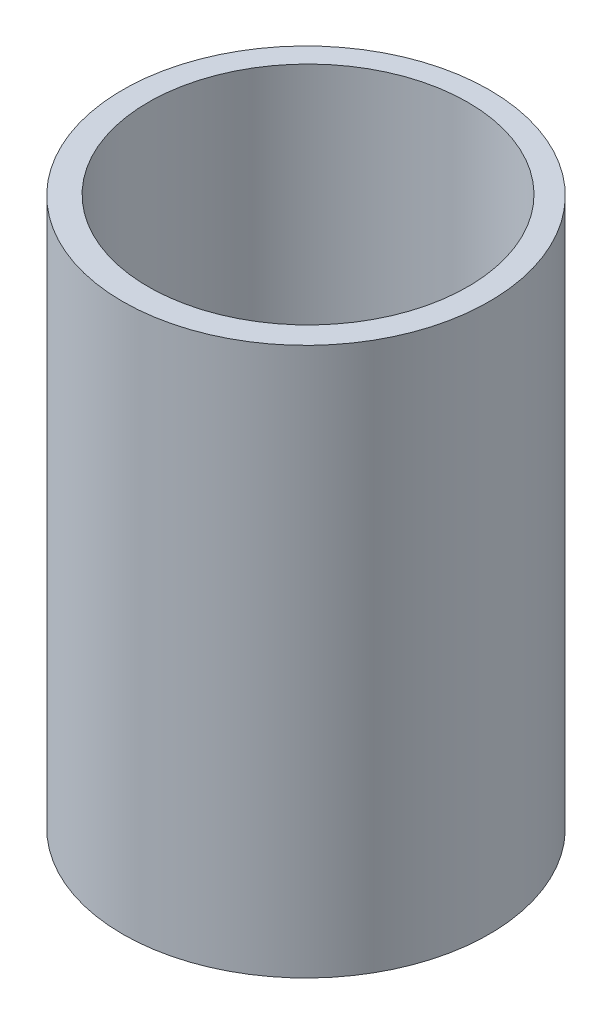
ISO-10303-21;
HEADER;
FILE_DESCRIPTION(('STEP AP214'),'2;1');
FILE_NAME('part.step','',(''),(''),'','','');
FILE_SCHEMA(('AUTOMOTIVE_DESIGN { 1 0 10303 214 1 1 1 1 }'));
ENDSEC;
DATA;
#1=APPLICATION_CONTEXT('core data for automotive mechanical design processes');
#2=APPLICATION_PROTOCOL_DEFINITION('international standard','automotive_design',2000,#1);
#3=PRODUCT_CONTEXT('',#1,'mechanical');
#4=PRODUCT('Part','Part','',(#3));
#5=PRODUCT_RELATED_PRODUCT_CATEGORY('part','',(#4));
#6=PRODUCT_DEFINITION_FORMATION('','',#4);
#7=PRODUCT_DEFINITION_CONTEXT('part definition',#1,'design');
#8=PRODUCT_DEFINITION('design','',#6,#7);
#9=PRODUCT_DEFINITION_SHAPE('','',#8);
#10=(LENGTH_UNIT() NAMED_UNIT(*) SI_UNIT(.MILLI.,.METRE.));
#11=(NAMED_UNIT(*) PLANE_ANGLE_UNIT() SI_UNIT($,.RADIAN.));
#12=(NAMED_UNIT(*) SI_UNIT($,.STERADIAN.) SOLID_ANGLE_UNIT());
#13=UNCERTAINTY_MEASURE_WITH_UNIT(LENGTH_MEASURE(1.E-05),#10,'distance_accuracy_value','');
#14=(GEOMETRIC_REPRESENTATION_CONTEXT(3) GLOBAL_UNCERTAINTY_ASSIGNED_CONTEXT((#13)) GLOBAL_UNIT_ASSIGNED_CONTEXT((#10,
#11,#12)) REPRESENTATION_CONTEXT('',''));
#15=CARTESIAN_POINT('',(0.,0.,0.));
#16=DIRECTION('',(0.,0.,1.));
#17=DIRECTION('',(1.,0.,0.));
#18=AXIS2_PLACEMENT_3D('',#15,#16,#17);
#19=CARTESIAN_POINT('',(0.,152.4,0.));
#20=DIRECTION('',(0.,1.,0.));
#21=DIRECTION('',(0.,0.,1.));
#22=AXIS2_PLACEMENT_3D('',#19,#20,#21);
#23=PLANE('',#22);
#24=CARTESIAN_POINT('',(0.,152.4,0.));
#25=DIRECTION('',(0.,1.,0.));
#26=DIRECTION('',(0.,0.,1.));
#27=AXIS2_PLACEMENT_3D('',#24,#25,#26);
#28=CIRCLE('',#27,51.);
#29=CARTESIAN_POINT('',(0.,152.4,-51.));
#30=VERTEX_POINT('',#29);
#31=EDGE_CURVE('E10',#30,#30,#28,.T.);
#32=ORIENTED_EDGE('',*,*,#31,.T.);
#33=EDGE_LOOP('',(#32));
#34=FACE_BOUND('',#33,.T.);
#35=CARTESIAN_POINT('',(0.,152.4,-0.566986597014049));
#36=DIRECTION('',(0.,1.,0.));
#37=DIRECTION('',(0.,0.,1.));
#38=AXIS2_PLACEMENT_3D('',#35,#36,#37);
#39=CIRCLE('',#38,44.45);
#40=CARTESIAN_POINT('',(0.,152.4,-45.0169865970141));
#41=VERTEX_POINT('',#40);
#42=EDGE_CURVE('E52',#41,#41,#39,.T.);
#43=ORIENTED_EDGE('',*,*,#42,.F.);
#44=EDGE_LOOP('',(#43));
#45=FACE_BOUND('',#44,.T.);
#46=ADVANCED_FACE('F39',(#34,#45),#23,.T.);
#47=CARTESIAN_POINT('',(0.,0.,0.));
#48=DIRECTION('',(0.,1.,0.));
#49=DIRECTION('',(0.,0.,1.));
#50=AXIS2_PLACEMENT_3D('',#47,#48,#49);
#51=PLANE('',#50);
#52=CARTESIAN_POINT('',(0.,0.,0.));
#53=DIRECTION('',(0.,1.,0.));
#54=DIRECTION('',(0.,0.,1.));
#55=AXIS2_PLACEMENT_3D('',#52,#53,#54);
#56=CIRCLE('',#55,51.);
#57=CARTESIAN_POINT('',(0.,0.,-51.));
#58=VERTEX_POINT('',#57);
#59=EDGE_CURVE('E43',#58,#58,#56,.T.);
#60=ORIENTED_EDGE('',*,*,#59,.F.);
#61=EDGE_LOOP('',(#60));
#62=FACE_BOUND('',#61,.T.);
#63=CARTESIAN_POINT('',(0.,0.,-0.566986597014049));
#64=DIRECTION('',(0.,1.,0.));
#65=DIRECTION('',(0.,0.,1.));
#66=AXIS2_PLACEMENT_3D('',#63,#64,#65);
#67=CIRCLE('',#66,44.45);
#68=CARTESIAN_POINT('',(0.,0.,-45.0169865970141));
#69=VERTEX_POINT('',#68);
#70=EDGE_CURVE('E54',#69,#69,#67,.T.);
#71=ORIENTED_EDGE('',*,*,#70,.T.);
#72=EDGE_LOOP('',(#71));
#73=FACE_BOUND('',#72,.T.);
#74=ADVANCED_FACE('F66',(#62,#73),#51,.F.);
#75=CARTESIAN_POINT('',(0.,152.4,0.));
#76=DIRECTION('',(0.,-1.,0.));
#77=DIRECTION('',(0.,0.,-1.));
#78=AXIS2_PLACEMENT_3D('',#75,#76,#77);
#79=CYLINDRICAL_SURFACE('',#78,51.);
#80=CARTESIAN_POINT('',(0.,152.4,-51.));
#81=CARTESIAN_POINT('',(0.,150.8125,-51.));
#82=CARTESIAN_POINT('',(0.,149.225,-51.));
#83=CARTESIAN_POINT('',(0.,146.05,-51.));
#84=CARTESIAN_POINT('',(0.,144.4625,-51.));
#85=CARTESIAN_POINT('',(0.,141.2875,-51.));
#86=CARTESIAN_POINT('',(0.,139.7,-51.));
#87=CARTESIAN_POINT('',(0.,136.525,-51.));
#88=CARTESIAN_POINT('',(0.,134.9375,-51.));
#89=CARTESIAN_POINT('',(0.,131.7625,-51.));
#90=CARTESIAN_POINT('',(0.,130.175,-51.));
#91=CARTESIAN_POINT('',(0.,127.,-51.));
#92=CARTESIAN_POINT('',(0.,125.4125,-51.));
#93=CARTESIAN_POINT('',(0.,122.2375,-51.));
#94=CARTESIAN_POINT('',(0.,120.65,-51.));
#95=CARTESIAN_POINT('',(0.,117.475,-51.));
#96=CARTESIAN_POINT('',(0.,115.8875,-51.));
#97=CARTESIAN_POINT('',(0.,112.7125,-51.));
#98=CARTESIAN_POINT('',(0.,111.125,-51.));
#99=CARTESIAN_POINT('',(0.,107.95,-51.));
#100=CARTESIAN_POINT('',(0.,106.3625,-51.));
#101=CARTESIAN_POINT('',(0.,103.1875,-51.));
#102=CARTESIAN_POINT('',(0.,101.6,-51.));
#103=CARTESIAN_POINT('',(0.,98.425,-51.));
#104=CARTESIAN_POINT('',(0.,96.8375,-51.));
#105=CARTESIAN_POINT('',(0.,93.6625,-51.));
#106=CARTESIAN_POINT('',(0.,92.075,-51.));
#107=CARTESIAN_POINT('',(0.,88.9,-51.));
#108=CARTESIAN_POINT('',(0.,87.3125,-51.));
#109=CARTESIAN_POINT('',(0.,84.1375,-51.));
#110=CARTESIAN_POINT('',(0.,82.55,-51.));
#111=CARTESIAN_POINT('',(0.,79.375,-51.));
#112=CARTESIAN_POINT('',(0.,77.7875,-51.));
#113=CARTESIAN_POINT('',(0.,74.6125,-51.));
#114=CARTESIAN_POINT('',(0.,73.025,-51.));
#115=CARTESIAN_POINT('',(0.,69.85,-51.));
#116=CARTESIAN_POINT('',(0.,68.2625,-51.));
#117=CARTESIAN_POINT('',(0.,65.0875,-51.));
#118=CARTESIAN_POINT('',(0.,63.5,-51.));
#119=CARTESIAN_POINT('',(0.,60.325,-51.));
#120=CARTESIAN_POINT('',(0.,58.7375,-51.));
#121=CARTESIAN_POINT('',(0.,55.5625,-51.));
#122=CARTESIAN_POINT('',(0.,53.975,-51.));
#123=CARTESIAN_POINT('',(0.,50.8,-51.));
#124=CARTESIAN_POINT('',(0.,49.2125,-51.));
#125=CARTESIAN_POINT('',(0.,46.0375,-51.));
#126=CARTESIAN_POINT('',(0.,44.45,-51.));
#127=CARTESIAN_POINT('',(0.,41.275,-51.));
#128=CARTESIAN_POINT('',(0.,39.6875,-51.));
#129=CARTESIAN_POINT('',(0.,36.5125,-51.));
#130=CARTESIAN_POINT('',(0.,34.925,-51.));
#131=CARTESIAN_POINT('',(0.,31.75,-51.));
#132=CARTESIAN_POINT('',(0.,30.1625,-51.));
#133=CARTESIAN_POINT('',(0.,26.9875,-51.));
#134=CARTESIAN_POINT('',(0.,25.4,-51.));
#135=CARTESIAN_POINT('',(0.,22.225,-51.));
#136=CARTESIAN_POINT('',(0.,20.6375,-51.));
#137=CARTESIAN_POINT('',(0.,17.4625,-51.));
#138=CARTESIAN_POINT('',(0.,15.875,-51.));
#139=CARTESIAN_POINT('',(0.,12.7,-51.));
#140=CARTESIAN_POINT('',(0.,11.1125,-51.));
#141=CARTESIAN_POINT('',(0.,7.93750000000001,-51.));
#142=CARTESIAN_POINT('',(0.,6.35,-51.));
#143=CARTESIAN_POINT('',(0.,3.175,-51.));
#144=CARTESIAN_POINT('',(0.,1.5875,-51.));
#145=CARTESIAN_POINT('',(0.,0.,-51.));
#146=B_SPLINE_CURVE_WITH_KNOTS('',3,(#80,#81,#82,#83,#84,#85,#86,#87,#88,#89,#90,#91,#92,#93,
#94,#95,#96,#97,#98,#99,#100,#101,#102,#103,#104,#105,#106,#107,#108,#109,#110,#111,#112,#113,
#114,#115,#116,#117,#118,#119,#120,#121,#122,#123,#124,#125,#126,#127,#128,#129,#130,#131,#132,
#133,#134,#135,#136,#137,#138,#139,#140,#141,#142,#143,#144,#145),.UNSPECIFIED.,.F.,.F.,(4,2,2,
2,2,2,2,2,2,2,2,2,2,2,2,2,2,2,2,2,2,2,2,2,2,2,2,2,2,2,2,2,4),(0.,4.7625,9.52500000000001,
14.2875,19.05,23.8125,28.575,33.3375,38.1,42.8625,47.625,52.3875,57.15,61.9125,66.675,71.4375,
76.2,80.9625,85.725,90.4875,95.25,100.0125,104.775,109.5375,114.3,119.0625,123.825,128.5875,
133.35,138.1125,142.875,147.6375,152.4),.UNSPECIFIED.);
#147=EDGE_CURVE('BSEAM41',#30,#58,#146,.T.);
#148=ORIENTED_EDGE('',*,*,#31,.F.);
#149=ORIENTED_EDGE('',*,*,#59,.T.);
#150=ORIENTED_EDGE('',*,*,#147,.T.);
#151=ORIENTED_EDGE('',*,*,#147,.F.);
#152=EDGE_LOOP('',(#148,#150,#149,#151));
#153=FACE_BOUND('',#152,.T.);
#154=ADVANCED_FACE('F41',(#153),#79,.T.);
#155=CARTESIAN_POINT('',(0.,152.4,-0.566986597014049));
#156=DIRECTION('',(0.,-1.,0.));
#157=DIRECTION('',(0.,0.,-1.));
#158=AXIS2_PLACEMENT_3D('',#155,#156,#157);
#159=CYLINDRICAL_SURFACE('',#158,44.45);
#160=CARTESIAN_POINT('',(0.,152.4,-45.0169865970141));
#161=CARTESIAN_POINT('',(0.,150.8125,-45.0169865970141));
#162=CARTESIAN_POINT('',(0.,149.225,-45.0169865970141));
#163=CARTESIAN_POINT('',(0.,146.05,-45.0169865970141));
#164=CARTESIAN_POINT('',(0.,144.4625,-45.0169865970141));
#165=CARTESIAN_POINT('',(0.,141.2875,-45.0169865970141));
#166=CARTESIAN_POINT('',(0.,139.7,-45.0169865970141));
#167=CARTESIAN_POINT('',(0.,136.525,-45.0169865970141));
#168=CARTESIAN_POINT('',(0.,134.9375,-45.0169865970141));
#169=CARTESIAN_POINT('',(0.,131.7625,-45.0169865970141));
#170=CARTESIAN_POINT('',(0.,130.175,-45.0169865970141));
#171=CARTESIAN_POINT('',(0.,127.,-45.0169865970141));
#172=CARTESIAN_POINT('',(0.,125.4125,-45.0169865970141));
#173=CARTESIAN_POINT('',(0.,122.2375,-45.0169865970141));
#174=CARTESIAN_POINT('',(0.,120.65,-45.0169865970141));
#175=CARTESIAN_POINT('',(0.,117.475,-45.0169865970141));
#176=CARTESIAN_POINT('',(0.,115.8875,-45.0169865970141));
#177=CARTESIAN_POINT('',(0.,112.7125,-45.0169865970141));
#178=CARTESIAN_POINT('',(0.,111.125,-45.0169865970141));
#179=CARTESIAN_POINT('',(0.,107.95,-45.0169865970141));
#180=CARTESIAN_POINT('',(0.,106.3625,-45.0169865970141));
#181=CARTESIAN_POINT('',(0.,103.1875,-45.0169865970141));
#182=CARTESIAN_POINT('',(0.,101.6,-45.0169865970141));
#183=CARTESIAN_POINT('',(0.,98.425,-45.0169865970141));
#184=CARTESIAN_POINT('',(0.,96.8375,-45.0169865970141));
#185=CARTESIAN_POINT('',(0.,93.6625,-45.0169865970141));
#186=CARTESIAN_POINT('',(0.,92.075,-45.0169865970141));
#187=CARTESIAN_POINT('',(0.,88.9,-45.0169865970141));
#188=CARTESIAN_POINT('',(0.,87.3125,-45.0169865970141));
#189=CARTESIAN_POINT('',(0.,84.1375,-45.0169865970141));
#190=CARTESIAN_POINT('',(0.,82.55,-45.0169865970141));
#191=CARTESIAN_POINT('',(0.,79.375,-45.0169865970141));
#192=CARTESIAN_POINT('',(0.,77.7875,-45.0169865970141));
#193=CARTESIAN_POINT('',(0.,74.6125,-45.0169865970141));
#194=CARTESIAN_POINT('',(0.,73.025,-45.0169865970141));
#195=CARTESIAN_POINT('',(0.,69.85,-45.0169865970141));
#196=CARTESIAN_POINT('',(0.,68.2625,-45.0169865970141));
#197=CARTESIAN_POINT('',(0.,65.0875,-45.0169865970141));
#198=CARTESIAN_POINT('',(0.,63.5,-45.0169865970141));
#199=CARTESIAN_POINT('',(0.,60.325,-45.0169865970141));
#200=CARTESIAN_POINT('',(0.,58.7375,-45.0169865970141));
#201=CARTESIAN_POINT('',(0.,55.5625,-45.0169865970141));
#202=CARTESIAN_POINT('',(0.,53.975,-45.0169865970141));
#203=CARTESIAN_POINT('',(0.,50.8,-45.0169865970141));
#204=CARTESIAN_POINT('',(0.,49.2125,-45.0169865970141));
#205=CARTESIAN_POINT('',(0.,46.0375,-45.0169865970141));
#206=CARTESIAN_POINT('',(0.,44.45,-45.0169865970141));
#207=CARTESIAN_POINT('',(0.,41.275,-45.0169865970141));
#208=CARTESIAN_POINT('',(0.,39.6875,-45.0169865970141));
#209=CARTESIAN_POINT('',(0.,36.5125,-45.0169865970141));
#210=CARTESIAN_POINT('',(0.,34.925,-45.0169865970141));
#211=CARTESIAN_POINT('',(0.,31.75,-45.0169865970141));
#212=CARTESIAN_POINT('',(0.,30.1625,-45.0169865970141));
#213=CARTESIAN_POINT('',(0.,26.9875,-45.0169865970141));
#214=CARTESIAN_POINT('',(0.,25.4,-45.0169865970141));
#215=CARTESIAN_POINT('',(0.,22.225,-45.0169865970141));
#216=CARTESIAN_POINT('',(0.,20.6375,-45.0169865970141));
#217=CARTESIAN_POINT('',(0.,17.4625,-45.0169865970141));
#218=CARTESIAN_POINT('',(0.,15.875,-45.0169865970141));
#219=CARTESIAN_POINT('',(0.,12.7,-45.0169865970141));
#220=CARTESIAN_POINT('',(0.,11.1125,-45.0169865970141));
#221=CARTESIAN_POINT('',(0.,7.93750000000001,-45.0169865970141));
#222=CARTESIAN_POINT('',(0.,6.35,-45.0169865970141));
#223=CARTESIAN_POINT('',(0.,3.175,-45.0169865970141));
#224=CARTESIAN_POINT('',(0.,1.5875,-45.0169865970141));
#225=CARTESIAN_POINT('',(0.,0.,-45.0169865970141));
#226=B_SPLINE_CURVE_WITH_KNOTS('',3,(#160,#161,#162,#163,#164,#165,#166,#167,#168,#169,#170,
#171,#172,#173,#174,#175,#176,#177,#178,#179,#180,#181,#182,#183,#184,#185,#186,#187,#188,#189,
#190,#191,#192,#193,#194,#195,#196,#197,#198,#199,#200,#201,#202,#203,#204,#205,#206,#207,#208,
#209,#210,#211,#212,#213,#214,#215,#216,#217,#218,#219,#220,#221,#222,#223,#224,#225),
.UNSPECIFIED.,.F.,.F.,(4,2,2,2,2,2,2,2,2,2,2,2,2,2,2,2,2,2,2,2,2,2,2,2,2,2,2,2,2,2,2,2,4),(0.,
4.76249999999998,9.52499999999998,14.2875,19.05,23.8125,28.575,33.3375,38.1,42.8625,47.625,
52.3875,57.15,61.9125,66.675,71.4375,76.2,80.9625,85.725,90.4875,95.25,100.0125,104.775,
109.5375,114.3,119.0625,123.825,128.5875,133.35,138.1125,142.875,147.6375,152.4),.UNSPECIFIED.);
#227=EDGE_CURVE('BSEAM62',#41,#69,#226,.T.);
#228=ORIENTED_EDGE('',*,*,#42,.T.);
#229=ORIENTED_EDGE('',*,*,#70,.F.);
#230=ORIENTED_EDGE('',*,*,#227,.T.);
#231=ORIENTED_EDGE('',*,*,#227,.F.);
#232=EDGE_LOOP('',(#228,#230,#229,#231));
#233=FACE_BOUND('',#232,.T.);
#234=ADVANCED_FACE('F62',(#233),#159,.F.);
#235=CLOSED_SHELL('',(#46,#74,#154,#234));
#236=MANIFOLD_SOLID_BREP('B2',#235);
#237=ADVANCED_BREP_SHAPE_REPRESENTATION('',(#18,#236),#14);
#238=SHAPE_DEFINITION_REPRESENTATION(#9,#237);
ENDSEC;
END-ISO-10303-21;
